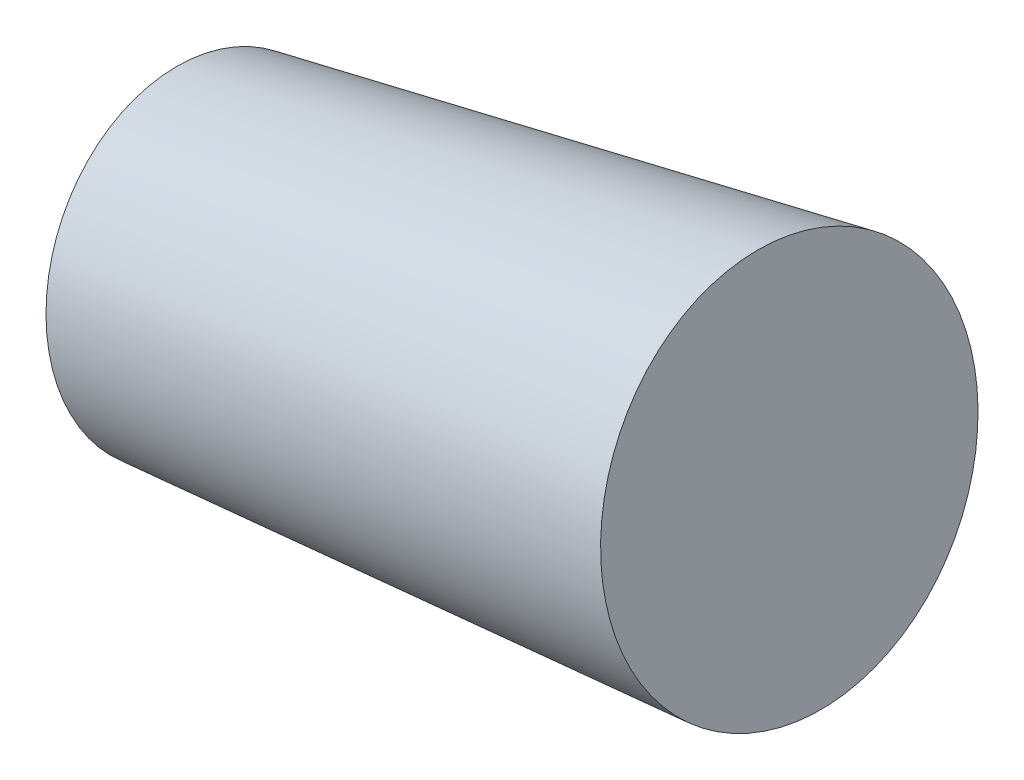
ISO-10303-21;
HEADER;
FILE_DESCRIPTION(('STEP AP214'),'2;1');
FILE_NAME('part.step','',(''),(''),'','','');
FILE_SCHEMA(('AUTOMOTIVE_DESIGN { 1 0 10303 214 1 1 1 1 }'));
ENDSEC;
DATA;
#1=APPLICATION_CONTEXT('core data for automotive mechanical design processes');
#2=APPLICATION_PROTOCOL_DEFINITION('international standard','automotive_design',2000,#1);
#3=PRODUCT_CONTEXT('',#1,'mechanical');
#4=PRODUCT('Part','Part','',(#3));
#5=PRODUCT_RELATED_PRODUCT_CATEGORY('part','',(#4));
#6=PRODUCT_DEFINITION_FORMATION('','',#4);
#7=PRODUCT_DEFINITION_CONTEXT('part definition',#1,'design');
#8=PRODUCT_DEFINITION('design','',#6,#7);
#9=PRODUCT_DEFINITION_SHAPE('','',#8);
#10=(LENGTH_UNIT() NAMED_UNIT(*) SI_UNIT(.MILLI.,.METRE.));
#11=(NAMED_UNIT(*) PLANE_ANGLE_UNIT() SI_UNIT($,.RADIAN.));
#12=(NAMED_UNIT(*) SI_UNIT($,.STERADIAN.) SOLID_ANGLE_UNIT());
#13=UNCERTAINTY_MEASURE_WITH_UNIT(LENGTH_MEASURE(1.E-05),#10,'distance_accuracy_value','');
#14=(GEOMETRIC_REPRESENTATION_CONTEXT(3) GLOBAL_UNCERTAINTY_ASSIGNED_CONTEXT((#13)) GLOBAL_UNIT_ASSIGNED_CONTEXT((#10,
#11,#12)) REPRESENTATION_CONTEXT('',''));
#15=CARTESIAN_POINT('',(0.,0.,0.));
#16=DIRECTION('',(0.,0.,1.));
#17=DIRECTION('',(1.,0.,0.));
#18=AXIS2_PLACEMENT_3D('',#15,#16,#17);
#19=CARTESIAN_POINT('',(3.10295868041732,19.7855930924987,0.));
#20=DIRECTION('',(-0.985556059058541,-0.169349503846328,0.));
#21=DIRECTION('',(-0.169349503846328,0.985556059058541,0.));
#22=AXIS2_PLACEMENT_3D('',#19,#20,#21);
#23=PLANE('',#22);
#24=CARTESIAN_POINT('',(3.10295868041732,19.7855930924987,0.));
#25=DIRECTION('',(0.985556059058541,0.169349503846328,0.));
#26=DIRECTION('',(-0.169349503846328,0.985556059058541,0.));
#27=AXIS2_PLACEMENT_3D('',#24,#25,#26);
#28=CIRCLE('',#27,3.75000000000033);
#29=CARTESIAN_POINT('',(2.46789804099353,23.4814283139685,0.));
#30=VERTEX_POINT('',#29);
#31=EDGE_CURVE('E11',#30,#30,#28,.T.);
#32=ORIENTED_EDGE('',*,*,#31,.F.);
#33=EDGE_LOOP('',(#32));
#34=FACE_BOUND('',#33,.T.);
#35=ADVANCED_FACE('F17',(#34),#23,.T.);
#36=CARTESIAN_POINT('',(10.1989623056426,21.0049095201929,0.));
#37=DIRECTION('',(0.985556059058541,0.169349503846328,0.));
#38=DIRECTION('',(-0.169349503846328,0.985556059058541,0.));
#39=AXIS2_PLACEMENT_3D('',#36,#37,#38);
#40=CONICAL_SURFACE('',#39,4.12733601083832,0.0523598775598137);
#41=CARTESIAN_POINT('',(17.2949659308795,22.2242259478891,0.));
#42=DIRECTION('',(0.985556059058541,0.169349503846328,0.));
#43=DIRECTION('',(-0.169349503846328,0.985556059058541,0.));
#44=AXIS2_PLACEMENT_3D('',#41,#42,#43);
#45=CIRCLE('',#44,4.5046720216763);
#46=CARTESIAN_POINT('',(16.5321019590065,26.6638327529216,0.));
#47=VERTEX_POINT('',#46);
#48=EDGE_CURVE('E25',#47,#47,#45,.T.);
#49=ORIENTED_EDGE('',*,*,#48,.F.);
#50=EDGE_LOOP('',(#49));
#51=FACE_BOUND('',#50,.T.);
#52=ORIENTED_EDGE('',*,*,#31,.T.);
#53=EDGE_LOOP('',(#52));
#54=FACE_BOUND('',#53,.T.);
#55=ADVANCED_FACE('F60',(#51,#54),#40,.T.);
#56=CARTESIAN_POINT('',(17.2949659308795,22.2242259478891,0.));
#57=DIRECTION('',(0.985556059058541,0.169349503846328,0.));
#58=DIRECTION('',(0.,0.,-1.));
#59=AXIS2_PLACEMENT_3D('',#56,#57,#58);
#60=PLANE('',#59);
#61=ORIENTED_EDGE('',*,*,#48,.T.);
#62=EDGE_LOOP('',(#61));
#63=FACE_BOUND('',#62,.T.);
#64=ADVANCED_FACE('F39',(#63),#60,.T.);
#65=CLOSED_SHELL('',(#35,#55,#64));
#66=MANIFOLD_SOLID_BREP('B1',#65);
#67=ADVANCED_BREP_SHAPE_REPRESENTATION('',(#18,#66),#14);
#68=SHAPE_DEFINITION_REPRESENTATION(#9,#67);
ENDSEC;
END-ISO-10303-21;
